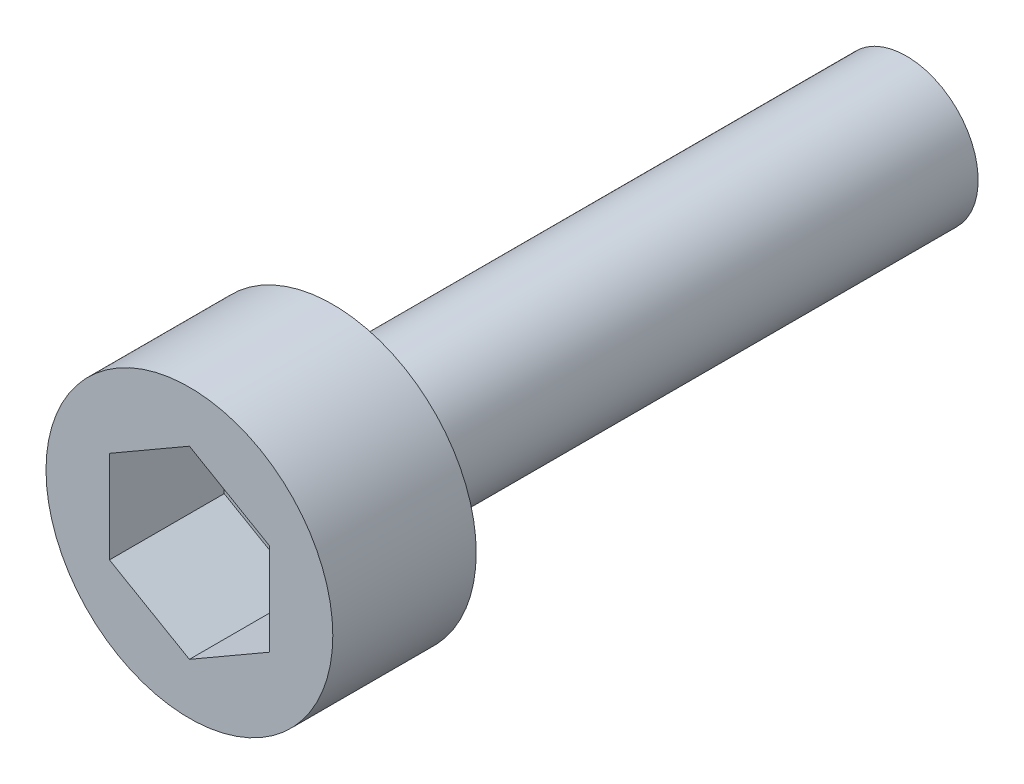
ISO-10303-21;
HEADER;
FILE_DESCRIPTION(('STEP AP214'),'2;1');
FILE_NAME('part.step','',(''),(''),'','','');
FILE_SCHEMA(('AUTOMOTIVE_DESIGN { 1 0 10303 214 1 1 1 1 }'));
ENDSEC;
DATA;
#1=APPLICATION_CONTEXT('core data for automotive mechanical design processes');
#2=APPLICATION_PROTOCOL_DEFINITION('international standard','automotive_design',2000,#1);
#3=PRODUCT_CONTEXT('',#1,'mechanical');
#4=PRODUCT('Part','Part','',(#3));
#5=PRODUCT_RELATED_PRODUCT_CATEGORY('part','',(#4));
#6=PRODUCT_DEFINITION_FORMATION('','',#4);
#7=PRODUCT_DEFINITION_CONTEXT('part definition',#1,'design');
#8=PRODUCT_DEFINITION('design','',#6,#7);
#9=PRODUCT_DEFINITION_SHAPE('','',#8);
#10=(LENGTH_UNIT() NAMED_UNIT(*) SI_UNIT(.MILLI.,.METRE.));
#11=(NAMED_UNIT(*) PLANE_ANGLE_UNIT() SI_UNIT($,.RADIAN.));
#12=(NAMED_UNIT(*) SI_UNIT($,.STERADIAN.) SOLID_ANGLE_UNIT());
#13=UNCERTAINTY_MEASURE_WITH_UNIT(LENGTH_MEASURE(1.E-05),#10,'distance_accuracy_value','');
#14=(GEOMETRIC_REPRESENTATION_CONTEXT(3) GLOBAL_UNCERTAINTY_ASSIGNED_CONTEXT((#13)) GLOBAL_UNIT_ASSIGNED_CONTEXT((#10,
#11,#12)) REPRESENTATION_CONTEXT('',''));
#15=CARTESIAN_POINT('',(0.,0.,0.));
#16=DIRECTION('',(0.,0.,1.));
#17=DIRECTION('',(1.,0.,0.));
#18=AXIS2_PLACEMENT_3D('',#15,#16,#17);
#19=CARTESIAN_POINT('',(367.033440134039,-490.,5.));
#20=DIRECTION('',(0.,0.,-1.));
#21=DIRECTION('',(-1.,0.,0.));
#22=AXIS2_PLACEMENT_3D('',#19,#20,#21);
#23=CYLINDRICAL_SURFACE('',#22,4.99999999999999);
#24=CARTESIAN_POINT('',(367.033440134039,-490.,5.));
#25=DIRECTION('',(0.,0.,1.));
#26=DIRECTION('',(1.,0.,0.));
#27=AXIS2_PLACEMENT_3D('',#24,#25,#26);
#28=CIRCLE('',#27,4.99999999999999);
#29=CARTESIAN_POINT('',(372.033440134039,-490.,5.));
#30=VERTEX_POINT('',#29);
#31=EDGE_CURVE('E40',#30,#30,#28,.T.);
#32=ORIENTED_EDGE('',*,*,#31,.F.);
#33=EDGE_LOOP('',(#32));
#34=FACE_BOUND('',#33,.T.);
#35=CARTESIAN_POINT('',(367.033440134039,-490.,0.));
#36=DIRECTION('',(0.,0.,1.));
#37=DIRECTION('',(1.,0.,0.));
#38=AXIS2_PLACEMENT_3D('',#35,#36,#37);
#39=CIRCLE('',#38,4.99999999999999);
#40=CARTESIAN_POINT('',(372.033440134039,-490.,0.));
#41=VERTEX_POINT('',#40);
#42=EDGE_CURVE('E35',#41,#41,#39,.T.);
#43=ORIENTED_EDGE('',*,*,#42,.T.);
#44=EDGE_LOOP('',(#43));
#45=FACE_BOUND('',#44,.T.);
#46=ADVANCED_FACE('F32',(#34,#45),#23,.T.);
#47=CARTESIAN_POINT('',(367.033440134039,-490.,5.));
#48=DIRECTION('',(0.,0.,1.));
#49=DIRECTION('',(1.,0.,0.));
#50=AXIS2_PLACEMENT_3D('',#47,#48,#49);
#51=PLANE('',#50);
#52=DIRECTION('',(0.866025403784443,-0.499999999999993,0.));
#53=VECTOR('',#52,1.);
#54=CARTESIAN_POINT('',(364.246402794235,-491.609096758377,5.));
#55=LINE('',#54,#53);
#56=CARTESIAN_POINT('',(364.246402794235,-491.609096758377,5.));
#57=VERTEX_POINT('',#56);
#58=CARTESIAN_POINT('',(367.033440134039,-493.218193516755,5.));
#59=VERTEX_POINT('',#58);
#60=EDGE_CURVE('E48',#57,#59,#55,.T.);
#61=ORIENTED_EDGE('',*,*,#60,.F.);
#62=DIRECTION('',(0.,-1.,0.));
#63=VECTOR('',#62,1.);
#64=CARTESIAN_POINT('',(364.246402794234,-488.390903241622,5.));
#65=LINE('',#64,#63);
#66=CARTESIAN_POINT('',(364.246402794234,-488.390903241622,5.));
#67=VERTEX_POINT('',#66);
#68=EDGE_CURVE('E131',#67,#57,#65,.T.);
#69=ORIENTED_EDGE('',*,*,#68,.F.);
#70=DIRECTION('',(-0.86602540378444,-0.499999999999998,0.));
#71=VECTOR('',#70,1.);
#72=CARTESIAN_POINT('',(367.033440134039,-486.781806483245,5.));
#73=LINE('',#72,#71);
#74=CARTESIAN_POINT('',(367.033440134039,-486.781806483245,5.));
#75=VERTEX_POINT('',#74);
#76=EDGE_CURVE('E129',#75,#67,#73,.T.);
#77=ORIENTED_EDGE('',*,*,#76,.F.);
#78=DIRECTION('',(-0.86602540378444,0.499999999999998,0.));
#79=VECTOR('',#78,1.);
#80=CARTESIAN_POINT('',(369.820477473843,-488.390903241622,5.));
#81=LINE('',#80,#79);
#82=CARTESIAN_POINT('',(369.820477473843,-488.390903241622,5.));
#83=VERTEX_POINT('',#82);
#84=EDGE_CURVE('E96',#83,#75,#81,.T.);
#85=ORIENTED_EDGE('',*,*,#84,.F.);
#86=DIRECTION('',(0.,1.,0.));
#87=VECTOR('',#86,1.);
#88=CARTESIAN_POINT('',(369.820477473843,-491.609096758377,5.));
#89=LINE('',#88,#87);
#90=CARTESIAN_POINT('',(369.820477473843,-491.609096758377,5.));
#91=VERTEX_POINT('',#90);
#92=EDGE_CURVE('E125',#91,#83,#89,.T.);
#93=ORIENTED_EDGE('',*,*,#92,.F.);
#94=DIRECTION('',(0.86602540378444,0.499999999999998,0.));
#95=VECTOR('',#94,1.);
#96=CARTESIAN_POINT('',(367.033440134039,-493.218193516755,5.));
#97=LINE('',#96,#95);
#98=EDGE_CURVE('E122',#59,#91,#97,.T.);
#99=ORIENTED_EDGE('',*,*,#98,.F.);
#100=EDGE_LOOP('',(#61,#69,#77,#85,#93,#99));
#101=FACE_BOUND('',#100,.T.);
#102=ORIENTED_EDGE('',*,*,#31,.T.);
#103=EDGE_LOOP('',(#102));
#104=FACE_BOUND('',#103,.T.);
#105=ADVANCED_FACE('F152',(#101,#104),#51,.T.);
#106=CARTESIAN_POINT('',(367.033440134039,-490.,0.));
#107=DIRECTION('',(0.,0.,1.));
#108=DIRECTION('',(1.,0.,0.));
#109=AXIS2_PLACEMENT_3D('',#106,#107,#108);
#110=PLANE('',#109);
#111=CARTESIAN_POINT('',(367.033440134039,-489.999999999997,0.));
#112=DIRECTION('',(0.,0.,-1.));
#113=DIRECTION('',(-1.,0.,0.));
#114=AXIS2_PLACEMENT_3D('',#111,#112,#113);
#115=CIRCLE('',#114,2.50000000000002);
#116=CARTESIAN_POINT('',(364.533440134039,-489.999999999997,0.));
#117=VERTEX_POINT('',#116);
#118=EDGE_CURVE('E11',#117,#117,#115,.T.);
#119=ORIENTED_EDGE('',*,*,#118,.F.);
#120=EDGE_LOOP('',(#119));
#121=FACE_BOUND('',#120,.T.);
#122=ORIENTED_EDGE('',*,*,#42,.F.);
#123=EDGE_LOOP('',(#122));
#124=FACE_BOUND('',#123,.T.);
#125=ADVANCED_FACE('F149',(#121,#124),#110,.F.);
#126=CARTESIAN_POINT('',(367.033440134039,-489.999999999997,-20.));
#127=DIRECTION('',(0.,0.,1.));
#128=DIRECTION('',(1.,0.,0.));
#129=AXIS2_PLACEMENT_3D('',#126,#127,#128);
#130=CYLINDRICAL_SURFACE('',#129,2.50000000000002);
#131=CARTESIAN_POINT('',(367.033440134039,-489.999999999997,-20.));
#132=DIRECTION('',(0.,0.,-1.));
#133=DIRECTION('',(-1.,0.,0.));
#134=AXIS2_PLACEMENT_3D('',#131,#132,#133);
#135=CIRCLE('',#134,2.50000000000002);
#136=CARTESIAN_POINT('',(364.533440134039,-489.999999999997,-20.));
#137=VERTEX_POINT('',#136);
#138=EDGE_CURVE('E135',#137,#137,#135,.T.);
#139=ORIENTED_EDGE('',*,*,#138,.F.);
#140=EDGE_LOOP('',(#139));
#141=FACE_BOUND('',#140,.T.);
#142=ORIENTED_EDGE('',*,*,#118,.T.);
#143=EDGE_LOOP('',(#142));
#144=FACE_BOUND('',#143,.T.);
#145=ADVANCED_FACE('F151',(#141,#144),#130,.T.);
#146=CARTESIAN_POINT('',(367.033440134039,-489.999999999997,-20.));
#147=DIRECTION('',(0.,0.,-1.));
#148=DIRECTION('',(-1.,0.,0.));
#149=AXIS2_PLACEMENT_3D('',#146,#147,#148);
#150=PLANE('',#149);
#151=ORIENTED_EDGE('',*,*,#138,.T.);
#152=EDGE_LOOP('',(#151));
#153=FACE_BOUND('',#152,.T.);
#154=ADVANCED_FACE('F158',(#153),#150,.T.);
#155=CARTESIAN_POINT('',(364.246402794235,-491.609096758377,1.));
#156=DIRECTION('',(-0.499999999999993,-0.866025403784443,0.));
#157=DIRECTION('',(0.866025403784443,-0.499999999999993,0.));
#158=AXIS2_PLACEMENT_3D('',#155,#156,#157);
#159=PLANE('',#158);
#160=ORIENTED_EDGE('',*,*,#60,.T.);
#161=DIRECTION('',(0.,0.,1.));
#162=VECTOR('',#161,1.);
#163=CARTESIAN_POINT('',(367.033440134039,-493.218193516755,1.));
#164=LINE('',#163,#162);
#165=CARTESIAN_POINT('',(367.033440134039,-493.218193516755,1.));
#166=VERTEX_POINT('',#165);
#167=EDGE_CURVE('E78',#166,#59,#164,.T.);
#168=ORIENTED_EDGE('',*,*,#167,.F.);
#169=DIRECTION('',(0.866025403784443,-0.499999999999993,0.));
#170=VECTOR('',#169,1.);
#171=CARTESIAN_POINT('',(364.246402794235,-491.609096758377,1.));
#172=LINE('',#171,#170);
#173=CARTESIAN_POINT('',(364.246402794235,-491.609096758377,1.));
#174=VERTEX_POINT('',#173);
#175=EDGE_CURVE('E133',#174,#166,#172,.T.);
#176=ORIENTED_EDGE('',*,*,#175,.F.);
#177=DIRECTION('',(0.,0.,1.));
#178=VECTOR('',#177,1.);
#179=CARTESIAN_POINT('',(364.246402794235,-491.609096758377,1.));
#180=LINE('',#179,#178);
#181=EDGE_CURVE('E56',#174,#57,#180,.T.);
#182=ORIENTED_EDGE('',*,*,#181,.T.);
#183=EDGE_LOOP('',(#160,#168,#176,#182));
#184=FACE_BOUND('',#183,.T.);
#185=ADVANCED_FACE('F183',(#184),#159,.F.);
#186=CARTESIAN_POINT('',(364.246402794234,-488.390903241622,1.));
#187=DIRECTION('',(-1.,0.,0.));
#188=DIRECTION('',(0.,-1.,0.));
#189=AXIS2_PLACEMENT_3D('',#186,#187,#188);
#190=PLANE('',#189);
#191=ORIENTED_EDGE('',*,*,#68,.T.);
#192=ORIENTED_EDGE('',*,*,#181,.F.);
#193=DIRECTION('',(0.,-1.,0.));
#194=VECTOR('',#193,1.);
#195=CARTESIAN_POINT('',(364.246402794234,-488.390903241622,1.));
#196=LINE('',#195,#194);
#197=CARTESIAN_POINT('',(364.246402794234,-488.390903241622,1.));
#198=VERTEX_POINT('',#197);
#199=EDGE_CURVE('E108',#198,#174,#196,.T.);
#200=ORIENTED_EDGE('',*,*,#199,.F.);
#201=DIRECTION('',(0.,0.,1.));
#202=VECTOR('',#201,1.);
#203=CARTESIAN_POINT('',(364.246402794234,-488.390903241622,1.));
#204=LINE('',#203,#202);
#205=EDGE_CURVE('E100',#198,#67,#204,.T.);
#206=ORIENTED_EDGE('',*,*,#205,.T.);
#207=EDGE_LOOP('',(#191,#192,#200,#206));
#208=FACE_BOUND('',#207,.T.);
#209=ADVANCED_FACE('F188',(#208),#190,.F.);
#210=CARTESIAN_POINT('',(367.033440134039,-486.781806483245,1.));
#211=DIRECTION('',(-0.499999999999998,0.86602540378444,0.));
#212=DIRECTION('',(-0.86602540378444,-0.499999999999998,0.));
#213=AXIS2_PLACEMENT_3D('',#210,#211,#212);
#214=PLANE('',#213);
#215=ORIENTED_EDGE('',*,*,#76,.T.);
#216=ORIENTED_EDGE('',*,*,#205,.F.);
#217=DIRECTION('',(-0.86602540378444,-0.499999999999998,0.));
#218=VECTOR('',#217,1.);
#219=CARTESIAN_POINT('',(367.033440134039,-486.781806483245,1.));
#220=LINE('',#219,#218);
#221=CARTESIAN_POINT('',(367.033440134039,-486.781806483245,1.));
#222=VERTEX_POINT('',#221);
#223=EDGE_CURVE('E104',#222,#198,#220,.T.);
#224=ORIENTED_EDGE('',*,*,#223,.F.);
#225=DIRECTION('',(0.,0.,1.));
#226=VECTOR('',#225,1.);
#227=CARTESIAN_POINT('',(367.033440134039,-486.781806483245,1.));
#228=LINE('',#227,#226);
#229=EDGE_CURVE('E89',#222,#75,#228,.T.);
#230=ORIENTED_EDGE('',*,*,#229,.T.);
#231=EDGE_LOOP('',(#215,#216,#224,#230));
#232=FACE_BOUND('',#231,.T.);
#233=ADVANCED_FACE('F105',(#232),#214,.F.);
#234=CARTESIAN_POINT('',(369.820477473843,-488.390903241622,1.));
#235=DIRECTION('',(0.499999999999998,0.86602540378444,0.));
#236=DIRECTION('',(-0.86602540378444,0.499999999999998,0.));
#237=AXIS2_PLACEMENT_3D('',#234,#235,#236);
#238=PLANE('',#237);
#239=ORIENTED_EDGE('',*,*,#84,.T.);
#240=ORIENTED_EDGE('',*,*,#229,.F.);
#241=DIRECTION('',(-0.86602540378444,0.499999999999998,0.));
#242=VECTOR('',#241,1.);
#243=CARTESIAN_POINT('',(369.820477473843,-488.390903241622,1.));
#244=LINE('',#243,#242);
#245=CARTESIAN_POINT('',(369.820477473843,-488.390903241622,1.));
#246=VERTEX_POINT('',#245);
#247=EDGE_CURVE('E93',#246,#222,#244,.T.);
#248=ORIENTED_EDGE('',*,*,#247,.F.);
#249=DIRECTION('',(0.,0.,1.));
#250=VECTOR('',#249,1.);
#251=CARTESIAN_POINT('',(369.820477473843,-488.390903241622,1.));
#252=LINE('',#251,#250);
#253=EDGE_CURVE('E101',#246,#83,#252,.T.);
#254=ORIENTED_EDGE('',*,*,#253,.T.);
#255=EDGE_LOOP('',(#239,#240,#248,#254));
#256=FACE_BOUND('',#255,.T.);
#257=ADVANCED_FACE('F91',(#256),#238,.F.);
#258=CARTESIAN_POINT('',(369.820477473843,-491.609096758377,1.));
#259=DIRECTION('',(1.,0.,0.));
#260=DIRECTION('',(0.,0.,-1.));
#261=AXIS2_PLACEMENT_3D('',#258,#259,#260);
#262=PLANE('',#261);
#263=ORIENTED_EDGE('',*,*,#92,.T.);
#264=ORIENTED_EDGE('',*,*,#253,.F.);
#265=DIRECTION('',(0.,1.,0.));
#266=VECTOR('',#265,1.);
#267=CARTESIAN_POINT('',(369.820477473843,-491.609096758377,1.));
#268=LINE('',#267,#266);
#269=CARTESIAN_POINT('',(369.820477473843,-491.609096758377,1.));
#270=VERTEX_POINT('',#269);
#271=EDGE_CURVE('E114',#270,#246,#268,.T.);
#272=ORIENTED_EDGE('',*,*,#271,.F.);
#273=DIRECTION('',(0.,0.,1.));
#274=VECTOR('',#273,1.);
#275=CARTESIAN_POINT('',(369.820477473843,-491.609096758377,1.));
#276=LINE('',#275,#274);
#277=EDGE_CURVE('E138',#270,#91,#276,.T.);
#278=ORIENTED_EDGE('',*,*,#277,.T.);
#279=EDGE_LOOP('',(#263,#264,#272,#278));
#280=FACE_BOUND('',#279,.T.);
#281=ADVANCED_FACE('F213',(#280),#262,.F.);
#282=CARTESIAN_POINT('',(367.033440134039,-493.218193516755,1.));
#283=DIRECTION('',(0.499999999999998,-0.86602540378444,0.));
#284=DIRECTION('',(0.86602540378444,0.499999999999998,0.));
#285=AXIS2_PLACEMENT_3D('',#282,#283,#284);
#286=PLANE('',#285);
#287=ORIENTED_EDGE('',*,*,#98,.T.);
#288=ORIENTED_EDGE('',*,*,#277,.F.);
#289=DIRECTION('',(0.86602540378444,0.499999999999998,0.));
#290=VECTOR('',#289,1.);
#291=CARTESIAN_POINT('',(367.033440134039,-493.218193516755,1.));
#292=LINE('',#291,#290);
#293=EDGE_CURVE('E116',#166,#270,#292,.T.);
#294=ORIENTED_EDGE('',*,*,#293,.F.);
#295=ORIENTED_EDGE('',*,*,#167,.T.);
#296=EDGE_LOOP('',(#287,#288,#294,#295));
#297=FACE_BOUND('',#296,.T.);
#298=ADVANCED_FACE('F222',(#297),#286,.F.);
#299=CARTESIAN_POINT('',(0.,0.,1.));
#300=DIRECTION('',(0.,0.,1.));
#301=DIRECTION('',(1.,0.,0.));
#302=AXIS2_PLACEMENT_3D('',#299,#300,#301);
#303=PLANE('',#302);
#304=ORIENTED_EDGE('',*,*,#175,.T.);
#305=ORIENTED_EDGE('',*,*,#293,.T.);
#306=ORIENTED_EDGE('',*,*,#271,.T.);
#307=ORIENTED_EDGE('',*,*,#247,.T.);
#308=ORIENTED_EDGE('',*,*,#223,.T.);
#309=ORIENTED_EDGE('',*,*,#199,.T.);
#310=EDGE_LOOP('',(#304,#305,#306,#307,#308,#309));
#311=FACE_BOUND('',#310,.T.);
#312=ADVANCED_FACE('F111',(#311),#303,.T.);
#313=CLOSED_SHELL('',(#46,#105,#125,#145,#154,#185,#209,#233,#257,#281,#298,#312));
#314=MANIFOLD_SOLID_BREP('B2',#313);
#315=ADVANCED_BREP_SHAPE_REPRESENTATION('',(#18,#314),#14);
#316=SHAPE_DEFINITION_REPRESENTATION(#9,#315);
ENDSEC;
END-ISO-10303-21;
